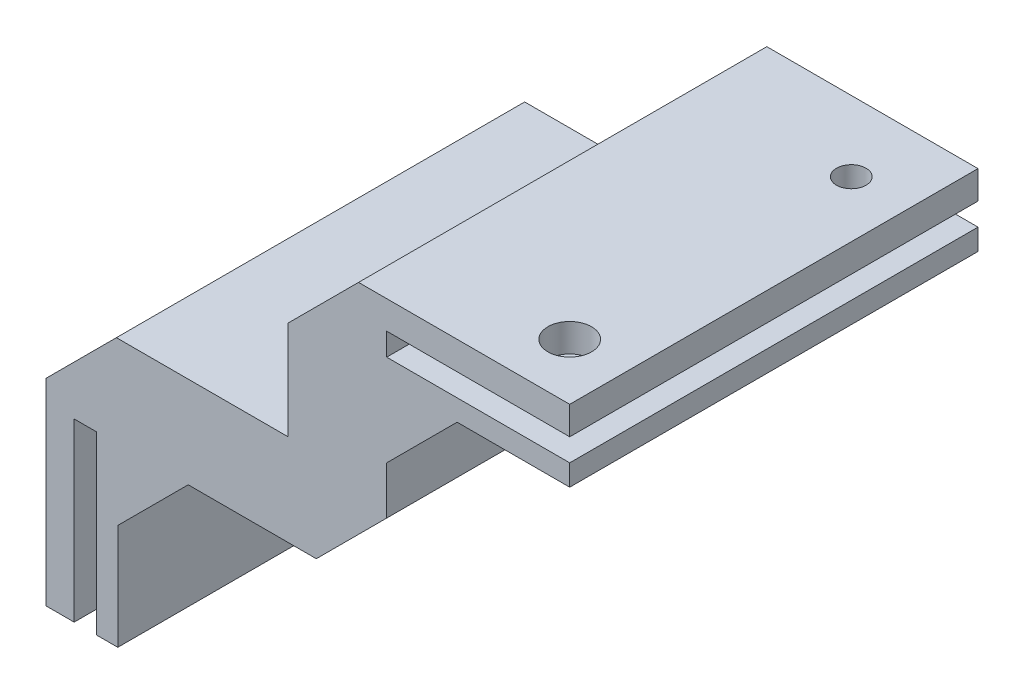
ISO-10303-21;
HEADER;
FILE_DESCRIPTION(('STEP AP214'),'2;1');
FILE_NAME('part.step','',(''),(''),'','','');
FILE_SCHEMA(('AUTOMOTIVE_DESIGN { 1 0 10303 214 1 1 1 1 }'));
ENDSEC;
DATA;
#1=APPLICATION_CONTEXT('core data for automotive mechanical design processes');
#2=APPLICATION_PROTOCOL_DEFINITION('international standard','automotive_design',2000,#1);
#3=PRODUCT_CONTEXT('',#1,'mechanical');
#4=PRODUCT('Part','Part','',(#3));
#5=PRODUCT_RELATED_PRODUCT_CATEGORY('part','',(#4));
#6=PRODUCT_DEFINITION_FORMATION('','',#4);
#7=PRODUCT_DEFINITION_CONTEXT('part definition',#1,'design');
#8=PRODUCT_DEFINITION('design','',#6,#7);
#9=PRODUCT_DEFINITION_SHAPE('','',#8);
#10=(LENGTH_UNIT() NAMED_UNIT(*) SI_UNIT(.MILLI.,.METRE.));
#11=(NAMED_UNIT(*) PLANE_ANGLE_UNIT() SI_UNIT($,.RADIAN.));
#12=(NAMED_UNIT(*) SI_UNIT($,.STERADIAN.) SOLID_ANGLE_UNIT());
#13=UNCERTAINTY_MEASURE_WITH_UNIT(LENGTH_MEASURE(1.E-05),#10,'distance_accuracy_value','');
#14=(GEOMETRIC_REPRESENTATION_CONTEXT(3) GLOBAL_UNCERTAINTY_ASSIGNED_CONTEXT((#13)) GLOBAL_UNIT_ASSIGNED_CONTEXT((#10,
#11,#12)) REPRESENTATION_CONTEXT('',''));
#15=CARTESIAN_POINT('',(0.,0.,0.));
#16=DIRECTION('',(0.,0.,1.));
#17=DIRECTION('',(1.,0.,0.));
#18=AXIS2_PLACEMENT_3D('',#15,#16,#17);
#19=CARTESIAN_POINT('',(-148.8,5.16253706450699E-13,58.));
#20=DIRECTION('',(1.,0.,0.));
#21=DIRECTION('',(0.,0.,1.));
#22=AXIS2_PLACEMENT_3D('',#19,#20,#21);
#23=PLANE('',#22);
#24=CARTESIAN_POINT('',(-148.8,-2.99999999999956,14.));
#25=DIRECTION('',(-1.,0.,0.));
#26=DIRECTION('',(0.,0.,1.));
#27=AXIS2_PLACEMENT_3D('',#24,#25,#26);
#28=CIRCLE('',#27,2.1);
#29=CARTESIAN_POINT('',(-148.8,-2.99999999999956,16.1));
#30=VERTEX_POINT('',#29);
#31=EDGE_CURVE('E605',#30,#30,#28,.T.);
#32=ORIENTED_EDGE('',*,*,#31,.F.);
#33=EDGE_LOOP('',(#32));
#34=FACE_BOUND('',#33,.T.);
#35=DIRECTION('',(0.,1.,0.));
#36=VECTOR('',#35,1.);
#37=CARTESIAN_POINT('',(-148.8,5.16253706450699E-13,0.));
#38=LINE('',#37,#36);
#39=CARTESIAN_POINT('',(-148.8,-9.99999999999948,0.));
#40=VERTEX_POINT('',#39);
#41=CARTESIAN_POINT('',(-148.8,18.0000000000005,0.));
#42=VERTEX_POINT('',#41);
#43=EDGE_CURVE('E238',#40,#42,#38,.T.);
#44=ORIENTED_EDGE('',*,*,#43,.F.);
#45=DIRECTION('',(0.,0.,1.));
#46=VECTOR('',#45,1.);
#47=CARTESIAN_POINT('',(-148.8,-9.99999999999948,0.));
#48=LINE('',#47,#46);
#49=CARTESIAN_POINT('',(-148.8,-9.99999999999948,58.));
#50=VERTEX_POINT('',#49);
#51=EDGE_CURVE('E634',#40,#50,#48,.T.);
#52=ORIENTED_EDGE('',*,*,#51,.T.);
#53=DIRECTION('',(0.,1.,0.));
#54=VECTOR('',#53,1.);
#55=CARTESIAN_POINT('',(-148.8,5.16253706450699E-13,58.));
#56=LINE('',#55,#54);
#57=CARTESIAN_POINT('',(-148.8,18.0000000000005,58.));
#58=VERTEX_POINT('',#57);
#59=EDGE_CURVE('E289',#50,#58,#56,.T.);
#60=ORIENTED_EDGE('',*,*,#59,.T.);
#61=DIRECTION('',(0.,0.,1.));
#62=VECTOR('',#61,1.);
#63=CARTESIAN_POINT('',(-148.8,18.0000000000005,58.));
#64=LINE('',#63,#62);
#65=EDGE_CURVE('E329',#42,#58,#64,.T.);
#66=ORIENTED_EDGE('',*,*,#65,.F.);
#67=EDGE_LOOP('',(#44,#52,#60,#66));
#68=FACE_BOUND('',#67,.T.);
#69=ADVANCED_FACE('F46',(#34,#68),#23,.F.);
#70=CARTESIAN_POINT('',(-148.8,28.0000000000005,58.));
#71=DIRECTION('',(0.,-1.,0.));
#72=DIRECTION('',(-1.,0.,0.));
#73=AXIS2_PLACEMENT_3D('',#70,#71,#72);
#74=PLANE('',#73);
#75=DIRECTION('',(1.,0.,0.));
#76=VECTOR('',#75,1.);
#77=CARTESIAN_POINT('',(-148.8,28.0000000000005,58.));
#78=LINE('',#77,#76);
#79=CARTESIAN_POINT('',(-138.8,28.0000000000004,58.));
#80=VERTEX_POINT('',#79);
#81=CARTESIAN_POINT('',(-114.4,28.0000000000003,58.));
#82=VERTEX_POINT('',#81);
#83=EDGE_CURVE('E640',#80,#82,#78,.T.);
#84=ORIENTED_EDGE('',*,*,#83,.T.);
#85=DIRECTION('',(0.,0.,-1.));
#86=VECTOR('',#85,1.);
#87=CARTESIAN_POINT('',(-114.4,28.0000000000003,58.));
#88=LINE('',#87,#86);
#89=CARTESIAN_POINT('',(-114.4,28.0000000000003,0.));
#90=VERTEX_POINT('',#89);
#91=EDGE_CURVE('E319',#82,#90,#88,.T.);
#92=ORIENTED_EDGE('',*,*,#91,.T.);
#93=DIRECTION('',(1.,0.,0.));
#94=VECTOR('',#93,1.);
#95=CARTESIAN_POINT('',(-148.8,28.0000000000005,0.));
#96=LINE('',#95,#94);
#97=CARTESIAN_POINT('',(-138.8,28.0000000000004,0.));
#98=VERTEX_POINT('',#97);
#99=EDGE_CURVE('E241',#98,#90,#96,.T.);
#100=ORIENTED_EDGE('',*,*,#99,.F.);
#101=DIRECTION('',(0.,0.,-1.));
#102=VECTOR('',#101,1.);
#103=CARTESIAN_POINT('',(-138.8,28.0000000000004,58.));
#104=LINE('',#103,#102);
#105=EDGE_CURVE('E322',#80,#98,#104,.T.);
#106=ORIENTED_EDGE('',*,*,#105,.F.);
#107=EDGE_LOOP('',(#84,#92,#100,#106));
#108=FACE_BOUND('',#107,.T.);
#109=ADVANCED_FACE('F407',(#108),#74,.F.);
#110=CARTESIAN_POINT('',(-114.4,28.0000000000003,58.));
#111=DIRECTION('',(1.,0.,0.));
#112=DIRECTION('',(0.,0.,1.));
#113=AXIS2_PLACEMENT_3D('',#110,#111,#112);
#114=PLANE('',#113);
#115=DIRECTION('',(0.,1.,0.));
#116=VECTOR('',#115,1.);
#117=CARTESIAN_POINT('',(-114.4,28.0000000000003,0.));
#118=LINE('',#117,#116);
#119=CARTESIAN_POINT('',(-114.4,42.0000000000002,0.));
#120=VERTEX_POINT('',#119);
#121=EDGE_CURVE('E245',#90,#120,#118,.T.);
#122=ORIENTED_EDGE('',*,*,#121,.F.);
#123=ORIENTED_EDGE('',*,*,#91,.F.);
#124=DIRECTION('',(0.,1.,0.));
#125=VECTOR('',#124,1.);
#126=CARTESIAN_POINT('',(-114.4,28.0000000000003,58.));
#127=LINE('',#126,#125);
#128=CARTESIAN_POINT('',(-114.4,42.0000000000002,58.));
#129=VERTEX_POINT('',#128);
#130=EDGE_CURVE('E643',#82,#129,#127,.T.);
#131=ORIENTED_EDGE('',*,*,#130,.T.);
#132=DIRECTION('',(0.,0.,1.));
#133=VECTOR('',#132,1.);
#134=CARTESIAN_POINT('',(-114.4,42.0000000000002,58.));
#135=LINE('',#134,#133);
#136=EDGE_CURVE('E339',#120,#129,#135,.T.);
#137=ORIENTED_EDGE('',*,*,#136,.F.);
#138=EDGE_LOOP('',(#122,#123,#131,#137));
#139=FACE_BOUND('',#138,.T.);
#140=ADVANCED_FACE('F413',(#139),#114,.F.);
#141=CARTESIAN_POINT('',(-114.4,52.0000000000003,58.));
#142=DIRECTION('',(0.,-1.,0.));
#143=DIRECTION('',(0.,0.,-1.));
#144=AXIS2_PLACEMENT_3D('',#141,#142,#143);
#145=PLANE('',#144);
#146=CARTESIAN_POINT('',(-82.4,52.0000000000001,10.));
#147=DIRECTION('',(0.,1.,0.));
#148=DIRECTION('',(-1.,0.,0.));
#149=AXIS2_PLACEMENT_3D('',#146,#147,#148);
#150=CIRCLE('',#149,2.1);
#151=CARTESIAN_POINT('',(-84.5,52.0000000000001,10.));
#152=VERTEX_POINT('',#151);
#153=EDGE_CURVE('E609',#152,#152,#150,.T.);
#154=ORIENTED_EDGE('',*,*,#153,.F.);
#155=EDGE_LOOP('',(#154));
#156=FACE_BOUND('',#155,.T.);
#157=CARTESIAN_POINT('',(-82.4,52.0000000000001,50.));
#158=DIRECTION('',(0.,1.,0.));
#159=DIRECTION('',(-1.,0.,0.));
#160=AXIS2_PLACEMENT_3D('',#157,#158,#159);
#161=CIRCLE('',#160,3.1);
#162=CARTESIAN_POINT('',(-85.5,52.0000000000001,50.));
#163=VERTEX_POINT('',#162);
#164=EDGE_CURVE('E599',#163,#163,#161,.T.);
#165=ORIENTED_EDGE('',*,*,#164,.F.);
#166=EDGE_LOOP('',(#165));
#167=FACE_BOUND('',#166,.T.);
#168=DIRECTION('',(1.,0.,0.));
#169=VECTOR('',#168,1.);
#170=CARTESIAN_POINT('',(-114.4,52.0000000000003,58.));
#171=LINE('',#170,#169);
#172=CARTESIAN_POINT('',(-104.4,52.0000000000002,58.));
#173=VERTEX_POINT('',#172);
#174=CARTESIAN_POINT('',(-74.4,52.,58.));
#175=VERTEX_POINT('',#174);
#176=EDGE_CURVE('E646',#173,#175,#171,.T.);
#177=ORIENTED_EDGE('',*,*,#176,.T.);
#178=DIRECTION('',(0.,0.,-1.));
#179=VECTOR('',#178,1.);
#180=CARTESIAN_POINT('',(-74.4,52.,58.));
#181=LINE('',#180,#179);
#182=CARTESIAN_POINT('',(-74.4,52.,0.));
#183=VERTEX_POINT('',#182);
#184=EDGE_CURVE('E316',#175,#183,#181,.T.);
#185=ORIENTED_EDGE('',*,*,#184,.T.);
#186=DIRECTION('',(1.,0.,0.));
#187=VECTOR('',#186,1.);
#188=CARTESIAN_POINT('',(-114.4,52.0000000000003,0.));
#189=LINE('',#188,#187);
#190=CARTESIAN_POINT('',(-104.4,52.0000000000002,0.));
#191=VERTEX_POINT('',#190);
#192=EDGE_CURVE('E248',#191,#183,#189,.T.);
#193=ORIENTED_EDGE('',*,*,#192,.F.);
#194=DIRECTION('',(0.,0.,-1.));
#195=VECTOR('',#194,1.);
#196=CARTESIAN_POINT('',(-104.4,52.0000000000002,58.));
#197=LINE('',#196,#195);
#198=EDGE_CURVE('E336',#173,#191,#197,.T.);
#199=ORIENTED_EDGE('',*,*,#198,.F.);
#200=EDGE_LOOP('',(#177,#185,#193,#199));
#201=FACE_BOUND('',#200,.T.);
#202=ADVANCED_FACE('F665',(#156,#167,#201),#145,.F.);
#203=CARTESIAN_POINT('',(-74.4,52.,58.));
#204=DIRECTION('',(-1.,0.,0.));
#205=DIRECTION('',(0.,1.,0.));
#206=AXIS2_PLACEMENT_3D('',#203,#204,#205);
#207=PLANE('',#206);
#208=DIRECTION('',(0.,-1.,0.));
#209=VECTOR('',#208,1.);
#210=CARTESIAN_POINT('',(-74.4,52.,0.));
#211=LINE('',#210,#209);
#212=CARTESIAN_POINT('',(-74.4,48.,0.));
#213=VERTEX_POINT('',#212);
#214=EDGE_CURVE('E251',#183,#213,#211,.T.);
#215=ORIENTED_EDGE('',*,*,#214,.F.);
#216=ORIENTED_EDGE('',*,*,#184,.F.);
#217=DIRECTION('',(0.,-1.,0.));
#218=VECTOR('',#217,1.);
#219=CARTESIAN_POINT('',(-74.4,52.,58.));
#220=LINE('',#219,#218);
#221=CARTESIAN_POINT('',(-74.4,48.,58.));
#222=VERTEX_POINT('',#221);
#223=EDGE_CURVE('E649',#175,#222,#220,.T.);
#224=ORIENTED_EDGE('',*,*,#223,.T.);
#225=DIRECTION('',(0.,0.,-1.));
#226=VECTOR('',#225,1.);
#227=CARTESIAN_POINT('',(-74.4,48.,58.));
#228=LINE('',#227,#226);
#229=EDGE_CURVE('E313',#222,#213,#228,.T.);
#230=ORIENTED_EDGE('',*,*,#229,.T.);
#231=EDGE_LOOP('',(#215,#216,#224,#230));
#232=FACE_BOUND('',#231,.T.);
#233=ADVANCED_FACE('F661',(#232),#207,.F.);
#234=CARTESIAN_POINT('',(-74.4,48.,58.));
#235=DIRECTION('',(0.,1.,0.));
#236=DIRECTION('',(1.,0.,0.));
#237=AXIS2_PLACEMENT_3D('',#234,#235,#236);
#238=PLANE('',#237);
#239=CARTESIAN_POINT('',(-82.4,48.,10.));
#240=DIRECTION('',(0.,-1.,0.));
#241=DIRECTION('',(1.,0.,0.));
#242=AXIS2_PLACEMENT_3D('',#239,#240,#241);
#243=CIRCLE('',#242,2.1);
#244=CARTESIAN_POINT('',(-80.3,48.,10.));
#245=VERTEX_POINT('',#244);
#246=EDGE_CURVE('E210',#245,#245,#243,.T.);
#247=ORIENTED_EDGE('',*,*,#246,.F.);
#248=EDGE_LOOP('',(#247));
#249=FACE_BOUND('',#248,.T.);
#250=CARTESIAN_POINT('',(-82.4,48.,50.));
#251=DIRECTION('',(0.,-1.,0.));
#252=DIRECTION('',(1.,0.,0.));
#253=AXIS2_PLACEMENT_3D('',#250,#251,#252);
#254=CIRCLE('',#253,3.1);
#255=CARTESIAN_POINT('',(-79.3,48.,50.));
#256=VERTEX_POINT('',#255);
#257=EDGE_CURVE('E620',#256,#256,#254,.T.);
#258=ORIENTED_EDGE('',*,*,#257,.F.);
#259=EDGE_LOOP('',(#258));
#260=FACE_BOUND('',#259,.T.);
#261=DIRECTION('',(-1.,0.,0.));
#262=VECTOR('',#261,1.);
#263=CARTESIAN_POINT('',(-74.4,48.,0.));
#264=LINE('',#263,#262);
#265=CARTESIAN_POINT('',(-100.4,48.0000000000002,0.));
#266=VERTEX_POINT('',#265);
#267=EDGE_CURVE('E254',#213,#266,#264,.T.);
#268=ORIENTED_EDGE('',*,*,#267,.F.);
#269=ORIENTED_EDGE('',*,*,#229,.F.);
#270=DIRECTION('',(-1.,0.,0.));
#271=VECTOR('',#270,1.);
#272=CARTESIAN_POINT('',(-74.4,48.,58.));
#273=LINE('',#272,#271);
#274=CARTESIAN_POINT('',(-100.4,48.0000000000002,58.));
#275=VERTEX_POINT('',#274);
#276=EDGE_CURVE('E379',#222,#275,#273,.T.);
#277=ORIENTED_EDGE('',*,*,#276,.T.);
#278=DIRECTION('',(0.,0.,-1.));
#279=VECTOR('',#278,1.);
#280=CARTESIAN_POINT('',(-100.4,48.0000000000002,58.));
#281=LINE('',#280,#279);
#282=EDGE_CURVE('E310',#275,#266,#281,.T.);
#283=ORIENTED_EDGE('',*,*,#282,.T.);
#284=EDGE_LOOP('',(#268,#269,#277,#283));
#285=FACE_BOUND('',#284,.T.);
#286=ADVANCED_FACE('F654',(#249,#260,#285),#238,.F.);
#287=CARTESIAN_POINT('',(-100.4,48.0000000000002,58.));
#288=DIRECTION('',(-1.,0.,0.));
#289=DIRECTION('',(0.,1.,0.));
#290=AXIS2_PLACEMENT_3D('',#287,#288,#289);
#291=PLANE('',#290);
#292=DIRECTION('',(0.,-1.,0.));
#293=VECTOR('',#292,1.);
#294=CARTESIAN_POINT('',(-100.4,48.0000000000002,0.));
#295=LINE('',#294,#293);
#296=CARTESIAN_POINT('',(-100.4,44.8000000000002,0.));
#297=VERTEX_POINT('',#296);
#298=EDGE_CURVE('E257',#266,#297,#295,.T.);
#299=ORIENTED_EDGE('',*,*,#298,.F.);
#300=ORIENTED_EDGE('',*,*,#282,.F.);
#301=DIRECTION('',(0.,-1.,0.));
#302=VECTOR('',#301,1.);
#303=CARTESIAN_POINT('',(-100.4,48.0000000000002,58.));
#304=LINE('',#303,#302);
#305=CARTESIAN_POINT('',(-100.4,44.8000000000002,58.));
#306=VERTEX_POINT('',#305);
#307=EDGE_CURVE('E376',#275,#306,#304,.T.);
#308=ORIENTED_EDGE('',*,*,#307,.T.);
#309=DIRECTION('',(0.,0.,-1.));
#310=VECTOR('',#309,1.);
#311=CARTESIAN_POINT('',(-100.4,44.8000000000002,58.));
#312=LINE('',#311,#310);
#313=EDGE_CURVE('E307',#306,#297,#312,.T.);
#314=ORIENTED_EDGE('',*,*,#313,.T.);
#315=EDGE_LOOP('',(#299,#300,#308,#314));
#316=FACE_BOUND('',#315,.T.);
#317=ADVANCED_FACE('F659',(#316),#291,.F.);
#318=CARTESIAN_POINT('',(-100.4,44.8000000000002,58.));
#319=DIRECTION('',(0.,-1.,0.));
#320=DIRECTION('',(-1.,0.,0.));
#321=AXIS2_PLACEMENT_3D('',#318,#319,#320);
#322=PLANE('',#321);
#323=CARTESIAN_POINT('',(-82.4,44.8000000000001,10.));
#324=DIRECTION('',(0.,1.,0.));
#325=DIRECTION('',(-1.,0.,0.));
#326=AXIS2_PLACEMENT_3D('',#323,#324,#325);
#327=CIRCLE('',#326,2.1);
#328=CARTESIAN_POINT('',(-84.5,44.8000000000001,10.));
#329=VERTEX_POINT('',#328);
#330=EDGE_CURVE('E623',#329,#329,#327,.T.);
#331=ORIENTED_EDGE('',*,*,#330,.F.);
#332=EDGE_LOOP('',(#331));
#333=FACE_BOUND('',#332,.T.);
#334=CARTESIAN_POINT('',(-82.4,44.8000000000001,50.));
#335=DIRECTION('',(0.,1.,0.));
#336=DIRECTION('',(-1.,0.,0.));
#337=AXIS2_PLACEMENT_3D('',#334,#335,#336);
#338=CIRCLE('',#337,3.1);
#339=CARTESIAN_POINT('',(-85.5,44.8000000000001,50.));
#340=VERTEX_POINT('',#339);
#341=EDGE_CURVE('E612',#340,#340,#338,.T.);
#342=ORIENTED_EDGE('',*,*,#341,.F.);
#343=EDGE_LOOP('',(#342));
#344=FACE_BOUND('',#343,.T.);
#345=DIRECTION('',(1.,0.,0.));
#346=VECTOR('',#345,1.);
#347=CARTESIAN_POINT('',(-100.4,44.8000000000002,0.));
#348=LINE('',#347,#346);
#349=CARTESIAN_POINT('',(-74.4,44.8,0.));
#350=VERTEX_POINT('',#349);
#351=EDGE_CURVE('E260',#297,#350,#348,.T.);
#352=ORIENTED_EDGE('',*,*,#351,.F.);
#353=ORIENTED_EDGE('',*,*,#313,.F.);
#354=DIRECTION('',(1.,0.,0.));
#355=VECTOR('',#354,1.);
#356=CARTESIAN_POINT('',(-100.4,44.8000000000002,58.));
#357=LINE('',#356,#355);
#358=CARTESIAN_POINT('',(-74.4,44.8,58.));
#359=VERTEX_POINT('',#358);
#360=EDGE_CURVE('E373',#306,#359,#357,.T.);
#361=ORIENTED_EDGE('',*,*,#360,.T.);
#362=DIRECTION('',(0.,0.,-1.));
#363=VECTOR('',#362,1.);
#364=CARTESIAN_POINT('',(-74.4,44.8,58.));
#365=LINE('',#364,#363);
#366=EDGE_CURVE('E304',#359,#350,#365,.T.);
#367=ORIENTED_EDGE('',*,*,#366,.T.);
#368=EDGE_LOOP('',(#352,#353,#361,#367));
#369=FACE_BOUND('',#368,.T.);
#370=ADVANCED_FACE('F371',(#333,#344,#369),#322,.F.);
#371=CARTESIAN_POINT('',(-74.4,44.8,58.));
#372=DIRECTION('',(-1.,0.,0.));
#373=DIRECTION('',(0.,0.,-1.));
#374=AXIS2_PLACEMENT_3D('',#371,#372,#373);
#375=PLANE('',#374);
#376=DIRECTION('',(0.,-1.,0.));
#377=VECTOR('',#376,1.);
#378=CARTESIAN_POINT('',(-74.4,44.8,0.));
#379=LINE('',#378,#377);
#380=CARTESIAN_POINT('',(-74.4000000000001,41.8,0.));
#381=VERTEX_POINT('',#380);
#382=EDGE_CURVE('E263',#350,#381,#379,.T.);
#383=ORIENTED_EDGE('',*,*,#382,.F.);
#384=ORIENTED_EDGE('',*,*,#366,.F.);
#385=DIRECTION('',(0.,-1.,0.));
#386=VECTOR('',#385,1.);
#387=CARTESIAN_POINT('',(-74.4,44.8,58.));
#388=LINE('',#387,#386);
#389=CARTESIAN_POINT('',(-74.4000000000001,41.8,58.));
#390=VERTEX_POINT('',#389);
#391=EDGE_CURVE('E375',#359,#390,#388,.T.);
#392=ORIENTED_EDGE('',*,*,#391,.T.);
#393=DIRECTION('',(0.,0.,-1.));
#394=VECTOR('',#393,1.);
#395=CARTESIAN_POINT('',(-74.4000000000001,41.8,58.));
#396=LINE('',#395,#394);
#397=EDGE_CURVE('E301',#390,#381,#396,.T.);
#398=ORIENTED_EDGE('',*,*,#397,.T.);
#399=EDGE_LOOP('',(#383,#384,#392,#398));
#400=FACE_BOUND('',#399,.T.);
#401=ADVANCED_FACE('F367',(#400),#375,.F.);
#402=CARTESIAN_POINT('',(-74.4000000000001,41.8,58.));
#403=DIRECTION('',(0.,1.,0.));
#404=DIRECTION('',(1.,0.,0.));
#405=AXIS2_PLACEMENT_3D('',#402,#403,#404);
#406=PLANE('',#405);
#407=CARTESIAN_POINT('',(-82.4000000000001,41.8000000000001,10.));
#408=DIRECTION('',(0.,1.,0.));
#409=DIRECTION('',(-1.,0.,0.));
#410=AXIS2_PLACEMENT_3D('',#407,#408,#409);
#411=CIRCLE('',#410,2.1);
#412=CARTESIAN_POINT('',(-84.5000000000001,41.8000000000001,10.));
#413=VERTEX_POINT('',#412);
#414=EDGE_CURVE('E613',#413,#413,#411,.T.);
#415=ORIENTED_EDGE('',*,*,#414,.T.);
#416=EDGE_LOOP('',(#415));
#417=FACE_BOUND('',#416,.T.);
#418=CARTESIAN_POINT('',(-82.4000000000001,41.8000000000001,50.));
#419=DIRECTION('',(0.,1.,0.));
#420=DIRECTION('',(-1.,0.,0.));
#421=AXIS2_PLACEMENT_3D('',#418,#419,#420);
#422=CIRCLE('',#421,3.1);
#423=CARTESIAN_POINT('',(-85.5000000000001,41.8000000000001,50.));
#424=VERTEX_POINT('',#423);
#425=EDGE_CURVE('E602',#424,#424,#422,.T.);
#426=ORIENTED_EDGE('',*,*,#425,.T.);
#427=EDGE_LOOP('',(#426));
#428=FACE_BOUND('',#427,.T.);
#429=DIRECTION('',(-1.,0.,0.));
#430=VECTOR('',#429,1.);
#431=CARTESIAN_POINT('',(-74.4000000000001,41.8,0.));
#432=LINE('',#431,#430);
#433=CARTESIAN_POINT('',(-90.4,41.8000000000001,0.));
#434=VERTEX_POINT('',#433);
#435=EDGE_CURVE('E266',#381,#434,#432,.T.);
#436=ORIENTED_EDGE('',*,*,#435,.F.);
#437=ORIENTED_EDGE('',*,*,#397,.F.);
#438=DIRECTION('',(-1.,0.,0.));
#439=VECTOR('',#438,1.);
#440=CARTESIAN_POINT('',(-74.4000000000001,41.8,58.));
#441=LINE('',#440,#439);
#442=CARTESIAN_POINT('',(-90.4,41.8000000000001,58.));
#443=VERTEX_POINT('',#442);
#444=EDGE_CURVE('E363',#390,#443,#441,.T.);
#445=ORIENTED_EDGE('',*,*,#444,.T.);
#446=DIRECTION('',(0.,0.,1.));
#447=VECTOR('',#446,1.);
#448=CARTESIAN_POINT('',(-90.4,41.8000000000001,58.));
#449=LINE('',#448,#447);
#450=EDGE_CURVE('E348',#434,#443,#449,.T.);
#451=ORIENTED_EDGE('',*,*,#450,.F.);
#452=EDGE_LOOP('',(#436,#437,#445,#451));
#453=FACE_BOUND('',#452,.T.);
#454=ADVANCED_FACE('F361',(#417,#428,#453),#406,.F.);
#455=CARTESIAN_POINT('',(-100.4,41.8000000000002,58.));
#456=DIRECTION('',(-1.,0.,0.));
#457=DIRECTION('',(0.,0.,-1.));
#458=AXIS2_PLACEMENT_3D('',#455,#456,#457);
#459=PLANE('',#458);
#460=DIRECTION('',(0.,-1.,0.));
#461=VECTOR('',#460,1.);
#462=CARTESIAN_POINT('',(-100.4,41.8000000000002,58.));
#463=LINE('',#462,#461);
#464=CARTESIAN_POINT('',(-100.4,31.8000000000001,58.));
#465=VERTEX_POINT('',#464);
#466=CARTESIAN_POINT('',(-100.4,25.0000000000002,58.));
#467=VERTEX_POINT('',#466);
#468=EDGE_CURVE('E384',#465,#467,#463,.T.);
#469=ORIENTED_EDGE('',*,*,#468,.T.);
#470=DIRECTION('',(0.,0.,-1.));
#471=VECTOR('',#470,1.);
#472=CARTESIAN_POINT('',(-100.4,25.0000000000002,58.));
#473=LINE('',#472,#471);
#474=CARTESIAN_POINT('',(-100.4,25.0000000000002,0.));
#475=VERTEX_POINT('',#474);
#476=EDGE_CURVE('E298',#467,#475,#473,.T.);
#477=ORIENTED_EDGE('',*,*,#476,.T.);
#478=DIRECTION('',(0.,-1.,0.));
#479=VECTOR('',#478,1.);
#480=CARTESIAN_POINT('',(-100.4,41.8000000000002,0.));
#481=LINE('',#480,#479);
#482=CARTESIAN_POINT('',(-100.4,31.8000000000001,0.));
#483=VERTEX_POINT('',#482);
#484=EDGE_CURVE('E269',#483,#475,#481,.T.);
#485=ORIENTED_EDGE('',*,*,#484,.F.);
#486=DIRECTION('',(0.,0.,-1.));
#487=VECTOR('',#486,1.);
#488=CARTESIAN_POINT('',(-100.4,31.8000000000001,0.));
#489=LINE('',#488,#487);
#490=EDGE_CURVE('E345',#465,#483,#489,.T.);
#491=ORIENTED_EDGE('',*,*,#490,.F.);
#492=EDGE_LOOP('',(#469,#477,#485,#491));
#493=FACE_BOUND('',#492,.T.);
#494=ADVANCED_FACE('F396',(#493),#459,.F.);
#495=CARTESIAN_POINT('',(-100.4,25.0000000000002,58.));
#496=DIRECTION('',(-0.707106781186542,0.707106781186553,0.));
#497=DIRECTION('',(0.707106781186553,0.707106781186542,0.));
#498=AXIS2_PLACEMENT_3D('',#495,#496,#497);
#499=PLANE('',#498);
#500=DIRECTION('',(-0.707106781186553,-0.707106781186542,0.));
#501=VECTOR('',#500,1.);
#502=CARTESIAN_POINT('',(-100.4,25.0000000000002,0.));
#503=LINE('',#502,#501);
#504=CARTESIAN_POINT('',(-110.4,15.0000000000002,0.));
#505=VERTEX_POINT('',#504);
#506=EDGE_CURVE('E272',#475,#505,#503,.T.);
#507=ORIENTED_EDGE('',*,*,#506,.F.);
#508=ORIENTED_EDGE('',*,*,#476,.F.);
#509=DIRECTION('',(-0.707106781186553,-0.707106781186542,0.));
#510=VECTOR('',#509,1.);
#511=CARTESIAN_POINT('',(-100.4,25.0000000000002,58.));
#512=LINE('',#511,#510);
#513=CARTESIAN_POINT('',(-110.4,15.0000000000002,58.));
#514=VERTEX_POINT('',#513);
#515=EDGE_CURVE('E228',#467,#514,#512,.T.);
#516=ORIENTED_EDGE('',*,*,#515,.T.);
#517=DIRECTION('',(0.,0.,-1.));
#518=VECTOR('',#517,1.);
#519=CARTESIAN_POINT('',(-110.4,15.0000000000002,58.));
#520=LINE('',#519,#518);
#521=EDGE_CURVE('E295',#514,#505,#520,.T.);
#522=ORIENTED_EDGE('',*,*,#521,.T.);
#523=EDGE_LOOP('',(#507,#508,#516,#522));
#524=FACE_BOUND('',#523,.T.);
#525=ADVANCED_FACE('F389',(#524),#499,.F.);
#526=CARTESIAN_POINT('',(-138.6,15.0000000000004,58.));
#527=DIRECTION('',(0.,1.,0.));
#528=DIRECTION('',(1.,0.,0.));
#529=AXIS2_PLACEMENT_3D('',#526,#527,#528);
#530=PLANE('',#529);
#531=DIRECTION('',(-1.,0.,0.));
#532=VECTOR('',#531,1.);
#533=CARTESIAN_POINT('',(-138.6,15.0000000000004,0.));
#534=LINE('',#533,#532);
#535=CARTESIAN_POINT('',(-128.6,15.0000000000004,0.));
#536=VERTEX_POINT('',#535);
#537=EDGE_CURVE('E275',#505,#536,#534,.T.);
#538=ORIENTED_EDGE('',*,*,#537,.F.);
#539=ORIENTED_EDGE('',*,*,#521,.F.);
#540=DIRECTION('',(-1.,0.,0.));
#541=VECTOR('',#540,1.);
#542=CARTESIAN_POINT('',(-138.6,15.0000000000004,58.));
#543=LINE('',#542,#541);
#544=CARTESIAN_POINT('',(-128.6,15.0000000000004,58.));
#545=VERTEX_POINT('',#544);
#546=EDGE_CURVE('E223',#514,#545,#543,.T.);
#547=ORIENTED_EDGE('',*,*,#546,.T.);
#548=DIRECTION('',(0.,0.,1.));
#549=VECTOR('',#548,1.);
#550=CARTESIAN_POINT('',(-128.6,15.0000000000004,58.));
#551=LINE('',#550,#549);
#552=EDGE_CURVE('E343',#536,#545,#551,.T.);
#553=ORIENTED_EDGE('',*,*,#552,.F.);
#554=EDGE_LOOP('',(#538,#539,#547,#553));
#555=FACE_BOUND('',#554,.T.);
#556=ADVANCED_FACE('F394',(#555),#530,.F.);
#557=CARTESIAN_POINT('',(-138.6,4.45085101655118E-13,58.));
#558=DIRECTION('',(-1.,0.,0.));
#559=DIRECTION('',(0.,0.,-1.));
#560=AXIS2_PLACEMENT_3D('',#557,#558,#559);
#561=PLANE('',#560);
#562=CARTESIAN_POINT('',(-138.6,-2.99999999999963,14.));
#563=DIRECTION('',(-1.,0.,0.));
#564=DIRECTION('',(0.,0.,1.));
#565=AXIS2_PLACEMENT_3D('',#562,#563,#564);
#566=CIRCLE('',#565,2.1);
#567=CARTESIAN_POINT('',(-138.6,-2.99999999999963,16.1));
#568=VERTEX_POINT('',#567);
#569=EDGE_CURVE('E595',#568,#568,#566,.T.);
#570=ORIENTED_EDGE('',*,*,#569,.T.);
#571=EDGE_LOOP('',(#570));
#572=FACE_BOUND('',#571,.T.);
#573=DIRECTION('',(0.,-1.,0.));
#574=VECTOR('',#573,1.);
#575=CARTESIAN_POINT('',(-138.6,4.45085101655118E-13,58.));
#576=LINE('',#575,#574);
#577=CARTESIAN_POINT('',(-138.6,5.00000000000037,58.));
#578=VERTEX_POINT('',#577);
#579=CARTESIAN_POINT('',(-138.6,-9.99999999999956,58.));
#580=VERTEX_POINT('',#579);
#581=EDGE_CURVE('E203',#578,#580,#576,.T.);
#582=ORIENTED_EDGE('',*,*,#581,.T.);
#583=DIRECTION('',(0.,0.,-1.));
#584=VECTOR('',#583,1.);
#585=CARTESIAN_POINT('',(-138.6,-9.99999999999956,58.));
#586=LINE('',#585,#584);
#587=CARTESIAN_POINT('',(-138.6,-9.99999999999956,0.));
#588=VERTEX_POINT('',#587);
#589=EDGE_CURVE('E213',#580,#588,#586,.T.);
#590=ORIENTED_EDGE('',*,*,#589,.T.);
#591=DIRECTION('',(0.,-1.,0.));
#592=VECTOR('',#591,1.);
#593=CARTESIAN_POINT('',(-138.6,4.45085101655118E-13,0.));
#594=LINE('',#593,#592);
#595=CARTESIAN_POINT('',(-138.6,5.00000000000037,0.));
#596=VERTEX_POINT('',#595);
#597=EDGE_CURVE('E278',#596,#588,#594,.T.);
#598=ORIENTED_EDGE('',*,*,#597,.F.);
#599=DIRECTION('',(0.,0.,-1.));
#600=VECTOR('',#599,1.);
#601=CARTESIAN_POINT('',(-138.6,5.00000000000037,0.));
#602=LINE('',#601,#600);
#603=EDGE_CURVE('E222',#578,#596,#602,.T.);
#604=ORIENTED_EDGE('',*,*,#603,.F.);
#605=EDGE_LOOP('',(#582,#590,#598,#604));
#606=FACE_BOUND('',#605,.T.);
#607=ADVANCED_FACE('F221',(#572,#606),#561,.F.);
#608=CARTESIAN_POINT('',(-141.6,15.0000000000005,58.));
#609=DIRECTION('',(1.,0.,0.));
#610=DIRECTION('',(0.,-1.,0.));
#611=AXIS2_PLACEMENT_3D('',#608,#609,#610);
#612=PLANE('',#611);
#613=CARTESIAN_POINT('',(-141.6,-2.99999999999961,14.));
#614=DIRECTION('',(-1.,0.,0.));
#615=DIRECTION('',(0.,-1.,0.));
#616=AXIS2_PLACEMENT_3D('',#613,#614,#615);
#617=CIRCLE('',#616,2.1);
#618=CARTESIAN_POINT('',(-141.6,-5.09999999999961,14.));
#619=VERTEX_POINT('',#618);
#620=EDGE_CURVE('E598',#619,#619,#617,.T.);
#621=ORIENTED_EDGE('',*,*,#620,.F.);
#622=EDGE_LOOP('',(#621));
#623=FACE_BOUND('',#622,.T.);
#624=DIRECTION('',(0.,1.,0.));
#625=VECTOR('',#624,1.);
#626=CARTESIAN_POINT('',(-141.6,15.0000000000005,0.));
#627=LINE('',#626,#625);
#628=CARTESIAN_POINT('',(-141.6,-9.99999999999953,0.));
#629=VERTEX_POINT('',#628);
#630=CARTESIAN_POINT('',(-141.6,15.0000000000005,0.));
#631=VERTEX_POINT('',#630);
#632=EDGE_CURVE('E280',#629,#631,#627,.T.);
#633=ORIENTED_EDGE('',*,*,#632,.F.);
#634=DIRECTION('',(0.,0.,1.));
#635=VECTOR('',#634,1.);
#636=CARTESIAN_POINT('',(-141.6,-9.99999999999953,0.));
#637=LINE('',#636,#635);
#638=CARTESIAN_POINT('',(-141.6,-9.99999999999953,58.));
#639=VERTEX_POINT('',#638);
#640=EDGE_CURVE('E209',#629,#639,#637,.T.);
#641=ORIENTED_EDGE('',*,*,#640,.T.);
#642=DIRECTION('',(0.,1.,0.));
#643=VECTOR('',#642,1.);
#644=CARTESIAN_POINT('',(-141.6,15.0000000000005,58.));
#645=LINE('',#644,#643);
#646=CARTESIAN_POINT('',(-141.6,15.0000000000005,58.));
#647=VERTEX_POINT('',#646);
#648=EDGE_CURVE('E205',#639,#647,#645,.T.);
#649=ORIENTED_EDGE('',*,*,#648,.T.);
#650=DIRECTION('',(0.,0.,-1.));
#651=VECTOR('',#650,1.);
#652=CARTESIAN_POINT('',(-141.6,15.0000000000005,58.));
#653=LINE('',#652,#651);
#654=EDGE_CURVE('E292',#647,#631,#653,.T.);
#655=ORIENTED_EDGE('',*,*,#654,.T.);
#656=EDGE_LOOP('',(#633,#641,#649,#655));
#657=FACE_BOUND('',#656,.T.);
#658=ADVANCED_FACE('F457',(#623,#657),#612,.F.);
#659=CARTESIAN_POINT('',(-144.8,15.0000000000005,58.));
#660=DIRECTION('',(0.,1.,0.));
#661=DIRECTION('',(0.,0.,1.));
#662=AXIS2_PLACEMENT_3D('',#659,#660,#661);
#663=PLANE('',#662);
#664=DIRECTION('',(-1.,0.,0.));
#665=VECTOR('',#664,1.);
#666=CARTESIAN_POINT('',(-144.8,15.0000000000005,0.));
#667=LINE('',#666,#665);
#668=CARTESIAN_POINT('',(-144.8,15.0000000000005,0.));
#669=VERTEX_POINT('',#668);
#670=EDGE_CURVE('E283',#631,#669,#667,.T.);
#671=ORIENTED_EDGE('',*,*,#670,.F.);
#672=ORIENTED_EDGE('',*,*,#654,.F.);
#673=DIRECTION('',(-1.,0.,0.));
#674=VECTOR('',#673,1.);
#675=CARTESIAN_POINT('',(-144.8,15.0000000000005,58.));
#676=LINE('',#675,#674);
#677=CARTESIAN_POINT('',(-144.8,15.0000000000005,58.));
#678=VERTEX_POINT('',#677);
#679=EDGE_CURVE('E225',#647,#678,#676,.T.);
#680=ORIENTED_EDGE('',*,*,#679,.T.);
#681=DIRECTION('',(0.,0.,-1.));
#682=VECTOR('',#681,1.);
#683=CARTESIAN_POINT('',(-144.8,15.0000000000005,58.));
#684=LINE('',#683,#682);
#685=EDGE_CURVE('E237',#678,#669,#684,.T.);
#686=ORIENTED_EDGE('',*,*,#685,.T.);
#687=EDGE_LOOP('',(#671,#672,#680,#686));
#688=FACE_BOUND('',#687,.T.);
#689=ADVANCED_FACE('F453',(#688),#663,.F.);
#690=CARTESIAN_POINT('',(-144.8,4.88130736795326E-13,58.));
#691=DIRECTION('',(-1.,0.,0.));
#692=DIRECTION('',(0.,0.,-1.));
#693=AXIS2_PLACEMENT_3D('',#690,#691,#692);
#694=PLANE('',#693);
#695=CARTESIAN_POINT('',(-144.8,-2.99999999999959,14.));
#696=DIRECTION('',(1.,0.,0.));
#697=DIRECTION('',(0.,0.,-1.));
#698=AXIS2_PLACEMENT_3D('',#695,#696,#697);
#699=CIRCLE('',#698,2.1);
#700=CARTESIAN_POINT('',(-144.8,-2.99999999999959,11.9));
#701=VERTEX_POINT('',#700);
#702=EDGE_CURVE('E50',#701,#701,#699,.T.);
#703=ORIENTED_EDGE('',*,*,#702,.F.);
#704=EDGE_LOOP('',(#703));
#705=FACE_BOUND('',#704,.T.);
#706=DIRECTION('',(0.,-1.,0.));
#707=VECTOR('',#706,1.);
#708=CARTESIAN_POINT('',(-144.8,4.88130736795326E-13,0.));
#709=LINE('',#708,#707);
#710=CARTESIAN_POINT('',(-144.8,-9.99999999999951,0.));
#711=VERTEX_POINT('',#710);
#712=EDGE_CURVE('E286',#669,#711,#709,.T.);
#713=ORIENTED_EDGE('',*,*,#712,.F.);
#714=ORIENTED_EDGE('',*,*,#685,.F.);
#715=DIRECTION('',(0.,-1.,0.));
#716=VECTOR('',#715,1.);
#717=CARTESIAN_POINT('',(-144.8,4.88130736795326E-13,58.));
#718=LINE('',#717,#716);
#719=CARTESIAN_POINT('',(-144.8,-9.99999999999951,58.));
#720=VERTEX_POINT('',#719);
#721=EDGE_CURVE('E234',#678,#720,#718,.T.);
#722=ORIENTED_EDGE('',*,*,#721,.T.);
#723=DIRECTION('',(0.,0.,-1.));
#724=VECTOR('',#723,1.);
#725=CARTESIAN_POINT('',(-144.8,-9.99999999999951,58.));
#726=LINE('',#725,#724);
#727=EDGE_CURVE('E219',#720,#711,#726,.T.);
#728=ORIENTED_EDGE('',*,*,#727,.T.);
#729=EDGE_LOOP('',(#713,#714,#722,#728));
#730=FACE_BOUND('',#729,.T.);
#731=ADVANCED_FACE('F448',(#705,#730),#694,.F.);
#732=CARTESIAN_POINT('',(-148.8,5.16253706450699E-13,58.));
#733=DIRECTION('',(0.,0.,1.));
#734=DIRECTION('',(-1.,0.,0.));
#735=AXIS2_PLACEMENT_3D('',#732,#733,#734);
#736=PLANE('',#735);
#737=ORIENTED_EDGE('',*,*,#59,.F.);
#738=DIRECTION('',(1.,0.,0.));
#739=VECTOR('',#738,1.);
#740=CARTESIAN_POINT('',(-148.8,-9.99999999999948,58.));
#741=LINE('',#740,#739);
#742=EDGE_CURVE('E242',#50,#720,#741,.T.);
#743=ORIENTED_EDGE('',*,*,#742,.T.);
#744=ORIENTED_EDGE('',*,*,#721,.F.);
#745=ORIENTED_EDGE('',*,*,#679,.F.);
#746=ORIENTED_EDGE('',*,*,#648,.F.);
#747=DIRECTION('',(1.,0.,0.));
#748=VECTOR('',#747,1.);
#749=CARTESIAN_POINT('',(-141.6,-9.99999999999953,58.));
#750=LINE('',#749,#748);
#751=EDGE_CURVE('E198',#639,#580,#750,.T.);
#752=ORIENTED_EDGE('',*,*,#751,.T.);
#753=ORIENTED_EDGE('',*,*,#581,.F.);
#754=DIRECTION('',(0.707106781186549,0.707106781186546,0.));
#755=VECTOR('',#754,1.);
#756=CARTESIAN_POINT('',(-138.6,5.00000000000037,58.));
#757=LINE('',#756,#755);
#758=EDGE_CURVE('E62',#545,#578,#757,.F.);
#759=ORIENTED_EDGE('',*,*,#758,.F.);
#760=ORIENTED_EDGE('',*,*,#546,.F.);
#761=ORIENTED_EDGE('',*,*,#515,.F.);
#762=ORIENTED_EDGE('',*,*,#468,.F.);
#763=DIRECTION('',(0.707106781186548,0.707106781186547,0.));
#764=VECTOR('',#763,1.);
#765=CARTESIAN_POINT('',(-100.4,31.8000000000001,58.));
#766=LINE('',#765,#764);
#767=EDGE_CURVE('E11',#443,#465,#766,.F.);
#768=ORIENTED_EDGE('',*,*,#767,.F.);
#769=ORIENTED_EDGE('',*,*,#444,.F.);
#770=ORIENTED_EDGE('',*,*,#391,.F.);
#771=ORIENTED_EDGE('',*,*,#360,.F.);
#772=ORIENTED_EDGE('',*,*,#307,.F.);
#773=ORIENTED_EDGE('',*,*,#276,.F.);
#774=ORIENTED_EDGE('',*,*,#223,.F.);
#775=ORIENTED_EDGE('',*,*,#176,.F.);
#776=DIRECTION('',(-0.707106781186551,-0.707106781186544,0.));
#777=VECTOR('',#776,1.);
#778=CARTESIAN_POINT('',(-152.6,3.80000000000046,58.));
#779=LINE('',#778,#777);
#780=EDGE_CURVE('E332',#129,#173,#779,.F.);
#781=ORIENTED_EDGE('',*,*,#780,.F.);
#782=ORIENTED_EDGE('',*,*,#130,.F.);
#783=ORIENTED_EDGE('',*,*,#83,.F.);
#784=DIRECTION('',(-0.707106781186551,-0.707106781186544,0.));
#785=VECTOR('',#784,1.);
#786=CARTESIAN_POINT('',(-157.8,9.00000000000053,58.));
#787=LINE('',#786,#785);
#788=EDGE_CURVE('E334',#58,#80,#787,.F.);
#789=ORIENTED_EDGE('',*,*,#788,.F.);
#790=EDGE_LOOP('',(#737,#743,#744,#745,#746,#752,#753,#759,#760,#761,#762,#768,#769,#770,#771,
#772,#773,#774,#775,#781,#782,#783,#789));
#791=FACE_BOUND('',#790,.T.);
#792=ADVANCED_FACE('F201',(#791),#736,.T.);
#793=CARTESIAN_POINT('',(-148.8,5.16253706450699E-13,0.));
#794=DIRECTION('',(0.,0.,1.));
#795=DIRECTION('',(-1.,0.,0.));
#796=AXIS2_PLACEMENT_3D('',#793,#794,#795);
#797=PLANE('',#796);
#798=ORIENTED_EDGE('',*,*,#99,.T.);
#799=ORIENTED_EDGE('',*,*,#121,.T.);
#800=DIRECTION('',(0.707106781186551,0.707106781186544,0.));
#801=VECTOR('',#800,1.);
#802=CARTESIAN_POINT('',(-104.4,52.0000000000002,0.));
#803=LINE('',#802,#801);
#804=EDGE_CURVE('E325',#191,#120,#803,.F.);
#805=ORIENTED_EDGE('',*,*,#804,.F.);
#806=ORIENTED_EDGE('',*,*,#192,.T.);
#807=ORIENTED_EDGE('',*,*,#214,.T.);
#808=ORIENTED_EDGE('',*,*,#267,.T.);
#809=ORIENTED_EDGE('',*,*,#298,.T.);
#810=ORIENTED_EDGE('',*,*,#351,.T.);
#811=ORIENTED_EDGE('',*,*,#382,.T.);
#812=ORIENTED_EDGE('',*,*,#435,.T.);
#813=DIRECTION('',(-0.707106781186548,-0.707106781186547,0.));
#814=VECTOR('',#813,1.);
#815=CARTESIAN_POINT('',(-140.5,-8.2999999999998,0.));
#816=LINE('',#815,#814);
#817=EDGE_CURVE('E55',#483,#434,#816,.F.);
#818=ORIENTED_EDGE('',*,*,#817,.F.);
#819=ORIENTED_EDGE('',*,*,#484,.T.);
#820=ORIENTED_EDGE('',*,*,#506,.T.);
#821=ORIENTED_EDGE('',*,*,#537,.T.);
#822=DIRECTION('',(-0.707106781186549,-0.707106781186546,0.));
#823=VECTOR('',#822,1.);
#824=CARTESIAN_POINT('',(-146.2,-2.59999999999957,0.));
#825=LINE('',#824,#823);
#826=EDGE_CURVE('E351',#596,#536,#825,.F.);
#827=ORIENTED_EDGE('',*,*,#826,.F.);
#828=ORIENTED_EDGE('',*,*,#597,.T.);
#829=DIRECTION('',(-1.,0.,0.));
#830=VECTOR('',#829,1.);
#831=CARTESIAN_POINT('',(-138.6,-9.99999999999956,0.));
#832=LINE('',#831,#830);
#833=EDGE_CURVE('E215',#588,#629,#832,.T.);
#834=ORIENTED_EDGE('',*,*,#833,.T.);
#835=ORIENTED_EDGE('',*,*,#632,.T.);
#836=ORIENTED_EDGE('',*,*,#670,.T.);
#837=ORIENTED_EDGE('',*,*,#712,.T.);
#838=DIRECTION('',(-1.,0.,0.));
#839=VECTOR('',#838,1.);
#840=CARTESIAN_POINT('',(-144.8,-9.99999999999951,0.));
#841=LINE('',#840,#839);
#842=EDGE_CURVE('E632',#711,#40,#841,.T.);
#843=ORIENTED_EDGE('',*,*,#842,.T.);
#844=ORIENTED_EDGE('',*,*,#43,.T.);
#845=DIRECTION('',(0.707106781186551,0.707106781186544,0.));
#846=VECTOR('',#845,1.);
#847=CARTESIAN_POINT('',(-138.8,28.0000000000004,0.));
#848=LINE('',#847,#846);
#849=EDGE_CURVE('E327',#98,#42,#848,.F.);
#850=ORIENTED_EDGE('',*,*,#849,.F.);
#851=EDGE_LOOP('',(#798,#799,#805,#806,#807,#808,#809,#810,#811,#812,#818,#819,#820,#821,#827,
#828,#834,#835,#836,#837,#843,#844,#850));
#852=FACE_BOUND('',#851,.T.);
#853=ADVANCED_FACE('F364',(#852),#797,.F.);
#854=CARTESIAN_POINT('',(-138.8,28.0000000000004,58.));
#855=DIRECTION('',(0.707106781186544,-0.707106781186551,0.));
#856=DIRECTION('',(0.,0.,-1.));
#857=AXIS2_PLACEMENT_3D('',#854,#855,#856);
#858=PLANE('',#857);
#859=ORIENTED_EDGE('',*,*,#788,.T.);
#860=ORIENTED_EDGE('',*,*,#105,.T.);
#861=ORIENTED_EDGE('',*,*,#849,.T.);
#862=ORIENTED_EDGE('',*,*,#65,.T.);
#863=EDGE_LOOP('',(#859,#860,#861,#862));
#864=FACE_BOUND('',#863,.T.);
#865=ADVANCED_FACE('F420',(#864),#858,.F.);
#866=CARTESIAN_POINT('',(-104.4,52.0000000000002,58.));
#867=DIRECTION('',(0.707106781186544,-0.707106781186551,0.));
#868=DIRECTION('',(0.,0.,-1.));
#869=AXIS2_PLACEMENT_3D('',#866,#867,#868);
#870=PLANE('',#869);
#871=ORIENTED_EDGE('',*,*,#780,.T.);
#872=ORIENTED_EDGE('',*,*,#198,.T.);
#873=ORIENTED_EDGE('',*,*,#804,.T.);
#874=ORIENTED_EDGE('',*,*,#136,.T.);
#875=EDGE_LOOP('',(#871,#872,#873,#874));
#876=FACE_BOUND('',#875,.T.);
#877=ADVANCED_FACE('F423',(#876),#870,.F.);
#878=CARTESIAN_POINT('',(-138.6,5.00000000000037,58.));
#879=DIRECTION('',(0.707106781186546,-0.707106781186549,0.));
#880=DIRECTION('',(0.,0.,1.));
#881=AXIS2_PLACEMENT_3D('',#878,#879,#880);
#882=PLANE('',#881);
#883=ORIENTED_EDGE('',*,*,#758,.T.);
#884=ORIENTED_EDGE('',*,*,#603,.T.);
#885=ORIENTED_EDGE('',*,*,#826,.T.);
#886=ORIENTED_EDGE('',*,*,#552,.T.);
#887=EDGE_LOOP('',(#883,#884,#885,#886));
#888=FACE_BOUND('',#887,.T.);
#889=ADVANCED_FACE('F426',(#888),#882,.T.);
#890=CARTESIAN_POINT('',(-100.4,31.8000000000001,58.));
#891=DIRECTION('',(0.707106781186547,-0.707106781186548,0.));
#892=DIRECTION('',(0.,0.,1.));
#893=AXIS2_PLACEMENT_3D('',#890,#891,#892);
#894=PLANE('',#893);
#895=ORIENTED_EDGE('',*,*,#767,.T.);
#896=ORIENTED_EDGE('',*,*,#490,.T.);
#897=ORIENTED_EDGE('',*,*,#817,.T.);
#898=ORIENTED_EDGE('',*,*,#450,.T.);
#899=EDGE_LOOP('',(#895,#896,#897,#898));
#900=FACE_BOUND('',#899,.T.);
#901=ADVANCED_FACE('F48',(#900),#894,.T.);
#902=CARTESIAN_POINT('',(-148.8,-9.99999999999948,0.));
#903=DIRECTION('',(0.,-1.,0.));
#904=DIRECTION('',(-1.,0.,0.));
#905=AXIS2_PLACEMENT_3D('',#902,#903,#904);
#906=PLANE('',#905);
#907=ORIENTED_EDGE('',*,*,#727,.F.);
#908=ORIENTED_EDGE('',*,*,#742,.F.);
#909=ORIENTED_EDGE('',*,*,#51,.F.);
#910=ORIENTED_EDGE('',*,*,#842,.F.);
#911=EDGE_LOOP('',(#907,#908,#909,#910));
#912=FACE_BOUND('',#911,.T.);
#913=ADVANCED_FACE('F432',(#912),#906,.T.);
#914=CARTESIAN_POINT('',(-148.8,-9.99999999999948,0.));
#915=DIRECTION('',(0.,-1.,0.));
#916=DIRECTION('',(-1.,0.,0.));
#917=AXIS2_PLACEMENT_3D('',#914,#915,#916);
#918=PLANE('',#917);
#919=ORIENTED_EDGE('',*,*,#589,.F.);
#920=ORIENTED_EDGE('',*,*,#751,.F.);
#921=ORIENTED_EDGE('',*,*,#640,.F.);
#922=ORIENTED_EDGE('',*,*,#833,.F.);
#923=EDGE_LOOP('',(#919,#920,#921,#922));
#924=FACE_BOUND('',#923,.T.);
#925=ADVANCED_FACE('F214',(#924),#918,.T.);
#926=CARTESIAN_POINT('',(-82.4,52.0000000000001,50.));
#927=DIRECTION('',(0.,-1.,0.));
#928=DIRECTION('',(-1.,0.,0.));
#929=AXIS2_PLACEMENT_3D('',#926,#927,#928);
#930=CYLINDRICAL_SURFACE('',#929,3.1);
#931=ORIENTED_EDGE('',*,*,#425,.F.);
#932=EDGE_LOOP('',(#931));
#933=FACE_BOUND('',#932,.T.);
#934=ORIENTED_EDGE('',*,*,#341,.T.);
#935=EDGE_LOOP('',(#934));
#936=FACE_BOUND('',#935,.T.);
#937=ADVANCED_FACE('F441',(#933,#936),#930,.F.);
#938=CARTESIAN_POINT('',(-82.4,52.0000000000001,10.));
#939=DIRECTION('',(0.,-1.,0.));
#940=DIRECTION('',(-1.,0.,0.));
#941=AXIS2_PLACEMENT_3D('',#938,#939,#940);
#942=CYLINDRICAL_SURFACE('',#941,2.1);
#943=ORIENTED_EDGE('',*,*,#414,.F.);
#944=EDGE_LOOP('',(#943));
#945=FACE_BOUND('',#944,.T.);
#946=ORIENTED_EDGE('',*,*,#330,.T.);
#947=EDGE_LOOP('',(#946));
#948=FACE_BOUND('',#947,.T.);
#949=ADVANCED_FACE('F541',(#945,#948),#942,.F.);
#950=ORIENTED_EDGE('',*,*,#164,.T.);
#951=EDGE_LOOP('',(#950));
#952=FACE_BOUND('',#951,.T.);
#953=ORIENTED_EDGE('',*,*,#257,.T.);
#954=EDGE_LOOP('',(#953));
#955=FACE_BOUND('',#954,.T.);
#956=ADVANCED_FACE('F543',(#952,#955),#930,.F.);
#957=ORIENTED_EDGE('',*,*,#153,.T.);
#958=EDGE_LOOP('',(#957));
#959=FACE_BOUND('',#958,.T.);
#960=ORIENTED_EDGE('',*,*,#246,.T.);
#961=EDGE_LOOP('',(#960));
#962=FACE_BOUND('',#961,.T.);
#963=ADVANCED_FACE('F554',(#959,#962),#942,.F.);
#964=CARTESIAN_POINT('',(-148.8,-2.99999999999956,14.));
#965=DIRECTION('',(1.,0.,0.));
#966=DIRECTION('',(0.,0.,1.));
#967=AXIS2_PLACEMENT_3D('',#964,#965,#966);
#968=CYLINDRICAL_SURFACE('',#967,2.1);
#969=ORIENTED_EDGE('',*,*,#31,.T.);
#970=EDGE_LOOP('',(#969));
#971=FACE_BOUND('',#970,.T.);
#972=ORIENTED_EDGE('',*,*,#702,.T.);
#973=EDGE_LOOP('',(#972));
#974=FACE_BOUND('',#973,.T.);
#975=ADVANCED_FACE('F570',(#971,#974),#968,.F.);
#976=ORIENTED_EDGE('',*,*,#569,.F.);
#977=EDGE_LOOP('',(#976));
#978=FACE_BOUND('',#977,.T.);
#979=ORIENTED_EDGE('',*,*,#620,.T.);
#980=EDGE_LOOP('',(#979));
#981=FACE_BOUND('',#980,.T.);
#982=ADVANCED_FACE('F581',(#978,#981),#968,.F.);
#983=CLOSED_SHELL('',(#69,#109,#140,#202,#233,#286,#317,#370,#401,#454,#494,#525,#556,#607,#658,
#689,#731,#792,#853,#865,#877,#889,#901,#913,#925,#937,#949,#956,#963,#975,#982));
#984=MANIFOLD_SOLID_BREP('B2',#983);
#985=ADVANCED_BREP_SHAPE_REPRESENTATION('',(#18,#984),#14);
#986=SHAPE_DEFINITION_REPRESENTATION(#9,#985);
ENDSEC;
END-ISO-10303-21;
